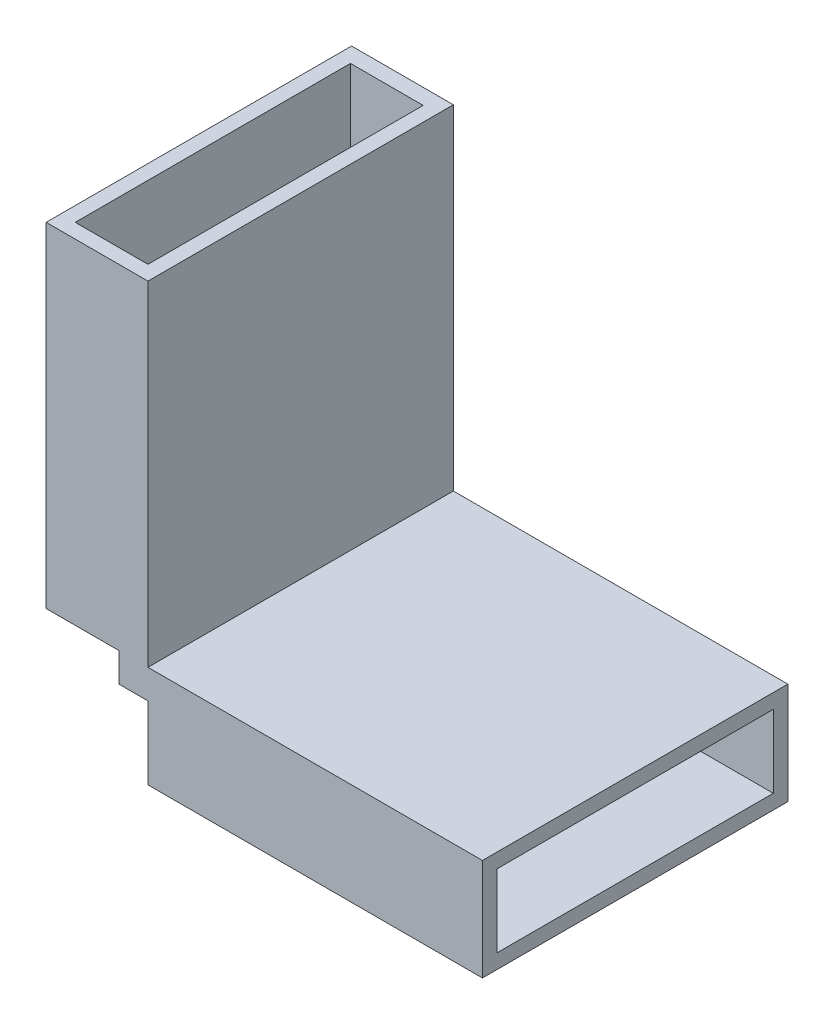
ISO-10303-21;
HEADER;
FILE_DESCRIPTION(('STEP AP214'),'2;1');
FILE_NAME('part.step','',(''),(''),'','','');
FILE_SCHEMA(('AUTOMOTIVE_DESIGN { 1 0 10303 214 1 1 1 1 }'));
ENDSEC;
DATA;
#1=APPLICATION_CONTEXT('core data for automotive mechanical design processes');
#2=APPLICATION_PROTOCOL_DEFINITION('international standard','automotive_design',2000,#1);
#3=PRODUCT_CONTEXT('',#1,'mechanical');
#4=PRODUCT('Part','Part','',(#3));
#5=PRODUCT_RELATED_PRODUCT_CATEGORY('part','',(#4));
#6=PRODUCT_DEFINITION_FORMATION('','',#4);
#7=PRODUCT_DEFINITION_CONTEXT('part definition',#1,'design');
#8=PRODUCT_DEFINITION('design','',#6,#7);
#9=PRODUCT_DEFINITION_SHAPE('','',#8);
#10=(LENGTH_UNIT() NAMED_UNIT(*) SI_UNIT(.MILLI.,.METRE.));
#11=(NAMED_UNIT(*) PLANE_ANGLE_UNIT() SI_UNIT($,.RADIAN.));
#12=(NAMED_UNIT(*) SI_UNIT($,.STERADIAN.) SOLID_ANGLE_UNIT());
#13=UNCERTAINTY_MEASURE_WITH_UNIT(LENGTH_MEASURE(1.E-05),#10,'distance_accuracy_value','');
#14=(GEOMETRIC_REPRESENTATION_CONTEXT(3) GLOBAL_UNCERTAINTY_ASSIGNED_CONTEXT((#13)) GLOBAL_UNIT_ASSIGNED_CONTEXT((#10,
#11,#12)) REPRESENTATION_CONTEXT('',''));
#15=CARTESIAN_POINT('',(0.,0.,0.));
#16=DIRECTION('',(0.,0.,1.));
#17=DIRECTION('',(1.,0.,0.));
#18=AXIS2_PLACEMENT_3D('',#15,#16,#17);
#19=CARTESIAN_POINT('',(30.,0.,7.));
#20=DIRECTION('',(-1.,0.,0.));
#21=DIRECTION('',(0.,0.,1.));
#22=AXIS2_PLACEMENT_3D('',#19,#20,#21);
#23=PLANE('',#22);
#24=DIRECTION('',(0.,0.,-1.));
#25=VECTOR('',#24,1.);
#26=CARTESIAN_POINT('',(30.,6.,27.));
#27=LINE('',#26,#25);
#28=CARTESIAN_POINT('',(30.,6.,26.));
#29=VERTEX_POINT('',#28);
#30=CARTESIAN_POINT('',(30.,6.,7.));
#31=VERTEX_POINT('',#30);
#32=EDGE_CURVE('E197',#29,#31,#27,.T.);
#33=ORIENTED_EDGE('',*,*,#32,.T.);
#34=DIRECTION('',(0.,1.,0.));
#35=VECTOR('',#34,1.);
#36=CARTESIAN_POINT('',(30.,0.999999999999997,7.));
#37=LINE('',#36,#35);
#38=CARTESIAN_POINT('',(30.,0.999999999999997,7.));
#39=VERTEX_POINT('',#38);
#40=EDGE_CURVE('E293',#39,#31,#37,.T.);
#41=ORIENTED_EDGE('',*,*,#40,.F.);
#42=DIRECTION('',(0.,0.,-1.));
#43=VECTOR('',#42,1.);
#44=CARTESIAN_POINT('',(30.,1.,7.));
#45=LINE('',#44,#43);
#46=CARTESIAN_POINT('',(30.,1.,26.));
#47=VERTEX_POINT('',#46);
#48=EDGE_CURVE('E190',#47,#39,#45,.T.);
#49=ORIENTED_EDGE('',*,*,#48,.F.);
#50=DIRECTION('',(0.,1.,0.));
#51=VECTOR('',#50,1.);
#52=CARTESIAN_POINT('',(30.,0.,26.));
#53=LINE('',#52,#51);
#54=EDGE_CURVE('E202',#47,#29,#53,.T.);
#55=ORIENTED_EDGE('',*,*,#54,.T.);
#56=EDGE_LOOP('',(#33,#41,#49,#55));
#57=FACE_BOUND('',#56,.T.);
#58=DIRECTION('',(0.,1.,0.));
#59=VECTOR('',#58,1.);
#60=CARTESIAN_POINT('',(30.,0.,6.));
#61=LINE('',#60,#59);
#62=CARTESIAN_POINT('',(30.,0.,6.));
#63=VERTEX_POINT('',#62);
#64=CARTESIAN_POINT('',(30.,7.,6.));
#65=VERTEX_POINT('',#64);
#66=EDGE_CURVE('E187',#63,#65,#61,.T.);
#67=ORIENTED_EDGE('',*,*,#66,.T.);
#68=DIRECTION('',(0.,0.,-1.));
#69=VECTOR('',#68,1.);
#70=CARTESIAN_POINT('',(30.,7.,27.));
#71=LINE('',#70,#69);
#72=CARTESIAN_POINT('',(30.,7.,27.));
#73=VERTEX_POINT('',#72);
#74=EDGE_CURVE('E52',#73,#65,#71,.T.);
#75=ORIENTED_EDGE('',*,*,#74,.F.);
#76=DIRECTION('',(0.,1.,0.));
#77=VECTOR('',#76,1.);
#78=CARTESIAN_POINT('',(30.,7.,27.));
#79=LINE('',#78,#77);
#80=CARTESIAN_POINT('',(30.,0.,27.));
#81=VERTEX_POINT('',#80);
#82=EDGE_CURVE('E213',#81,#73,#79,.T.);
#83=ORIENTED_EDGE('',*,*,#82,.F.);
#84=DIRECTION('',(0.,0.,-1.));
#85=VECTOR('',#84,1.);
#86=CARTESIAN_POINT('',(30.,0.,7.));
#87=LINE('',#86,#85);
#88=EDGE_CURVE('E243',#81,#63,#87,.T.);
#89=ORIENTED_EDGE('',*,*,#88,.T.);
#90=EDGE_LOOP('',(#67,#75,#83,#89));
#91=FACE_BOUND('',#90,.T.);
#92=ADVANCED_FACE('F37',(#57,#91),#23,.F.);
#93=CARTESIAN_POINT('',(0.,30.,7.));
#94=DIRECTION('',(0.,-1.,0.));
#95=DIRECTION('',(0.,0.,-1.));
#96=AXIS2_PLACEMENT_3D('',#93,#94,#95);
#97=PLANE('',#96);
#98=DIRECTION('',(1.,0.,0.));
#99=VECTOR('',#98,1.);
#100=CARTESIAN_POINT('',(1.,30.,7.07514362919426));
#101=LINE('',#100,#99);
#102=CARTESIAN_POINT('',(1.,30.,7.07514362919426));
#103=VERTEX_POINT('',#102);
#104=CARTESIAN_POINT('',(6.,30.,7.07514362919426));
#105=VERTEX_POINT('',#104);
#106=EDGE_CURVE('E280',#103,#105,#101,.T.);
#107=ORIENTED_EDGE('',*,*,#106,.T.);
#108=DIRECTION('',(0.,0.,-1.));
#109=VECTOR('',#108,1.);
#110=CARTESIAN_POINT('',(6.,30.,7.));
#111=LINE('',#110,#109);
#112=CARTESIAN_POINT('',(6.,30.,26.));
#113=VERTEX_POINT('',#112);
#114=EDGE_CURVE('E192',#113,#105,#111,.T.);
#115=ORIENTED_EDGE('',*,*,#114,.F.);
#116=DIRECTION('',(-1.,0.,0.));
#117=VECTOR('',#116,1.);
#118=CARTESIAN_POINT('',(0.,30.,26.));
#119=LINE('',#118,#117);
#120=CARTESIAN_POINT('',(1.,30.,26.));
#121=VERTEX_POINT('',#120);
#122=EDGE_CURVE('E310',#113,#121,#119,.T.);
#123=ORIENTED_EDGE('',*,*,#122,.T.);
#124=DIRECTION('',(0.,0.,-1.));
#125=VECTOR('',#124,1.);
#126=CARTESIAN_POINT('',(1.,30.,7.));
#127=LINE('',#126,#125);
#128=EDGE_CURVE('E186',#121,#103,#127,.T.);
#129=ORIENTED_EDGE('',*,*,#128,.T.);
#130=EDGE_LOOP('',(#107,#115,#123,#129));
#131=FACE_BOUND('',#130,.T.);
#132=DIRECTION('',(0.,0.,-1.));
#133=VECTOR('',#132,1.);
#134=CARTESIAN_POINT('',(7.,30.,27.));
#135=LINE('',#134,#133);
#136=CARTESIAN_POINT('',(7.,30.,27.));
#137=VERTEX_POINT('',#136);
#138=CARTESIAN_POINT('',(7.,30.,6.));
#139=VERTEX_POINT('',#138);
#140=EDGE_CURVE('E239',#137,#139,#135,.T.);
#141=ORIENTED_EDGE('',*,*,#140,.T.);
#142=DIRECTION('',(-1.,0.,0.));
#143=VECTOR('',#142,1.);
#144=CARTESIAN_POINT('',(0.,30.,6.));
#145=LINE('',#144,#143);
#146=CARTESIAN_POINT('',(0.,30.,6.));
#147=VERTEX_POINT('',#146);
#148=EDGE_CURVE('E180',#139,#147,#145,.T.);
#149=ORIENTED_EDGE('',*,*,#148,.T.);
#150=DIRECTION('',(0.,0.,-1.));
#151=VECTOR('',#150,1.);
#152=CARTESIAN_POINT('',(0.,30.,7.));
#153=LINE('',#152,#151);
#154=CARTESIAN_POINT('',(0.,30.,27.));
#155=VERTEX_POINT('',#154);
#156=EDGE_CURVE('E241',#155,#147,#153,.T.);
#157=ORIENTED_EDGE('',*,*,#156,.F.);
#158=DIRECTION('',(-1.,0.,0.));
#159=VECTOR('',#158,1.);
#160=CARTESIAN_POINT('',(0.,30.,27.));
#161=LINE('',#160,#159);
#162=EDGE_CURVE('E231',#137,#155,#161,.T.);
#163=ORIENTED_EDGE('',*,*,#162,.F.);
#164=EDGE_LOOP('',(#141,#149,#157,#163));
#165=FACE_BOUND('',#164,.T.);
#166=ADVANCED_FACE('F323',(#131,#165),#97,.F.);
#167=CARTESIAN_POINT('',(0.,0.,7.));
#168=DIRECTION('',(1.,0.,0.));
#169=DIRECTION('',(0.,0.,-1.));
#170=AXIS2_PLACEMENT_3D('',#167,#168,#169);
#171=PLANE('',#170);
#172=DIRECTION('',(0.,1.,0.));
#173=VECTOR('',#172,1.);
#174=CARTESIAN_POINT('',(0.,0.,6.));
#175=LINE('',#174,#173);
#176=CARTESIAN_POINT('',(0.,7.,6.));
#177=VERTEX_POINT('',#176);
#178=EDGE_CURVE('E183',#177,#147,#175,.T.);
#179=ORIENTED_EDGE('',*,*,#178,.F.);
#180=DIRECTION('',(0.,0.,-1.));
#181=VECTOR('',#180,1.);
#182=CARTESIAN_POINT('',(0.,7.,27.));
#183=LINE('',#182,#181);
#184=CARTESIAN_POINT('',(0.,7.,27.));
#185=VERTEX_POINT('',#184);
#186=EDGE_CURVE('E237',#185,#177,#183,.T.);
#187=ORIENTED_EDGE('',*,*,#186,.F.);
#188=DIRECTION('',(0.,-1.,0.));
#189=VECTOR('',#188,1.);
#190=CARTESIAN_POINT('',(0.,0.,27.));
#191=LINE('',#190,#189);
#192=EDGE_CURVE('E234',#155,#185,#191,.T.);
#193=ORIENTED_EDGE('',*,*,#192,.F.);
#194=ORIENTED_EDGE('',*,*,#156,.T.);
#195=EDGE_LOOP('',(#179,#187,#193,#194));
#196=FACE_BOUND('',#195,.T.);
#197=ADVANCED_FACE('F39',(#196),#171,.F.);
#198=CARTESIAN_POINT('',(0.,0.,7.));
#199=DIRECTION('',(0.,1.,0.));
#200=DIRECTION('',(0.,0.,1.));
#201=AXIS2_PLACEMENT_3D('',#198,#199,#200);
#202=PLANE('',#201);
#203=DIRECTION('',(0.,0.,-1.));
#204=VECTOR('',#203,1.);
#205=CARTESIAN_POINT('',(7.,0.,27.));
#206=LINE('',#205,#204);
#207=CARTESIAN_POINT('',(7.,0.,27.));
#208=VERTEX_POINT('',#207);
#209=CARTESIAN_POINT('',(7.,0.,6.));
#210=VERTEX_POINT('',#209);
#211=EDGE_CURVE('E217',#208,#210,#206,.T.);
#212=ORIENTED_EDGE('',*,*,#211,.T.);
#213=DIRECTION('',(-1.,0.,0.));
#214=VECTOR('',#213,1.);
#215=CARTESIAN_POINT('',(30.,0.,6.));
#216=LINE('',#215,#214);
#217=EDGE_CURVE('E278',#63,#210,#216,.T.);
#218=ORIENTED_EDGE('',*,*,#217,.F.);
#219=ORIENTED_EDGE('',*,*,#88,.F.);
#220=DIRECTION('',(1.,0.,0.));
#221=VECTOR('',#220,1.);
#222=CARTESIAN_POINT('',(7.,0.,27.));
#223=LINE('',#222,#221);
#224=EDGE_CURVE('E210',#208,#81,#223,.T.);
#225=ORIENTED_EDGE('',*,*,#224,.F.);
#226=EDGE_LOOP('',(#212,#218,#219,#225));
#227=FACE_BOUND('',#226,.T.);
#228=ADVANCED_FACE('F342',(#227),#202,.F.);
#229=CARTESIAN_POINT('',(6.,0.,27.));
#230=DIRECTION('',(-1.,0.,0.));
#231=DIRECTION('',(0.,-1.,0.));
#232=AXIS2_PLACEMENT_3D('',#229,#230,#231);
#233=PLANE('',#232);
#234=ORIENTED_EDGE('',*,*,#114,.T.);
#235=DIRECTION('',(0.,1.,0.));
#236=VECTOR('',#235,1.);
#237=CARTESIAN_POINT('',(6.,30.,7.07514362919426));
#238=LINE('',#237,#236);
#239=CARTESIAN_POINT('',(6.,8.,7.07514362919426));
#240=VERTEX_POINT('',#239);
#241=EDGE_CURVE('E277',#240,#105,#238,.T.);
#242=ORIENTED_EDGE('',*,*,#241,.F.);
#243=DIRECTION('',(0.,0.,-1.));
#244=VECTOR('',#243,1.);
#245=CARTESIAN_POINT('',(6.,8.,27.));
#246=LINE('',#245,#244);
#247=CARTESIAN_POINT('',(6.,8.,26.));
#248=VERTEX_POINT('',#247);
#249=EDGE_CURVE('E297',#248,#240,#246,.T.);
#250=ORIENTED_EDGE('',*,*,#249,.F.);
#251=DIRECTION('',(0.,1.,0.));
#252=VECTOR('',#251,1.);
#253=CARTESIAN_POINT('',(6.,0.,26.));
#254=LINE('',#253,#252);
#255=EDGE_CURVE('E303',#248,#113,#254,.T.);
#256=ORIENTED_EDGE('',*,*,#255,.T.);
#257=EDGE_LOOP('',(#234,#242,#250,#256));
#258=FACE_BOUND('',#257,.T.);
#259=ADVANCED_FACE('F340',(#258),#233,.T.);
#260=CARTESIAN_POINT('',(0.,8.,27.));
#261=DIRECTION('',(0.,-1.,0.));
#262=DIRECTION('',(1.,0.,0.));
#263=AXIS2_PLACEMENT_3D('',#260,#261,#262);
#264=PLANE('',#263);
#265=DIRECTION('',(1.,0.,0.));
#266=VECTOR('',#265,1.);
#267=CARTESIAN_POINT('',(0.,8.,7.07514362919426));
#268=LINE('',#267,#266);
#269=CARTESIAN_POINT('',(1.,8.,7.07514362919426));
#270=VERTEX_POINT('',#269);
#271=EDGE_CURVE('E287',#270,#240,#268,.T.);
#272=ORIENTED_EDGE('',*,*,#271,.F.);
#273=DIRECTION('',(0.,0.,-1.));
#274=VECTOR('',#273,1.);
#275=CARTESIAN_POINT('',(1.,8.,7.));
#276=LINE('',#275,#274);
#277=CARTESIAN_POINT('',(1.,8.,26.));
#278=VERTEX_POINT('',#277);
#279=EDGE_CURVE('E304',#278,#270,#276,.T.);
#280=ORIENTED_EDGE('',*,*,#279,.F.);
#281=DIRECTION('',(-1.,0.,0.));
#282=VECTOR('',#281,1.);
#283=CARTESIAN_POINT('',(0.,8.,26.));
#284=LINE('',#283,#282);
#285=EDGE_CURVE('E300',#248,#278,#284,.T.);
#286=ORIENTED_EDGE('',*,*,#285,.F.);
#287=ORIENTED_EDGE('',*,*,#249,.T.);
#288=EDGE_LOOP('',(#272,#280,#286,#287));
#289=FACE_BOUND('',#288,.T.);
#290=ADVANCED_FACE('F335',(#289),#264,.F.);
#291=CARTESIAN_POINT('',(1.,0.,7.));
#292=DIRECTION('',(1.,0.,0.));
#293=DIRECTION('',(0.,0.,-1.));
#294=AXIS2_PLACEMENT_3D('',#291,#292,#293);
#295=PLANE('',#294);
#296=ORIENTED_EDGE('',*,*,#279,.T.);
#297=DIRECTION('',(0.,1.,0.));
#298=VECTOR('',#297,1.);
#299=CARTESIAN_POINT('',(1.,0.,7.07514362919426));
#300=LINE('',#299,#298);
#301=EDGE_CURVE('E249',#270,#103,#300,.T.);
#302=ORIENTED_EDGE('',*,*,#301,.T.);
#303=ORIENTED_EDGE('',*,*,#128,.F.);
#304=DIRECTION('',(0.,-1.,0.));
#305=VECTOR('',#304,1.);
#306=CARTESIAN_POINT('',(1.,0.,26.));
#307=LINE('',#306,#305);
#308=EDGE_CURVE('E307',#121,#278,#307,.T.);
#309=ORIENTED_EDGE('',*,*,#308,.T.);
#310=EDGE_LOOP('',(#296,#302,#303,#309));
#311=FACE_BOUND('',#310,.T.);
#312=ADVANCED_FACE('F332',(#311),#295,.T.);
#313=CARTESIAN_POINT('',(7.,6.,27.));
#314=DIRECTION('',(0.,-1.,0.));
#315=DIRECTION('',(0.,0.,-1.));
#316=AXIS2_PLACEMENT_3D('',#313,#314,#315);
#317=PLANE('',#316);
#318=DIRECTION('',(0.,0.,-1.));
#319=VECTOR('',#318,1.);
#320=CARTESIAN_POINT('',(8.,6.,27.));
#321=LINE('',#320,#319);
#322=CARTESIAN_POINT('',(8.,6.,26.));
#323=VERTEX_POINT('',#322);
#324=CARTESIAN_POINT('',(8.,6.,7.));
#325=VERTEX_POINT('',#324);
#326=EDGE_CURVE('E301',#323,#325,#321,.T.);
#327=ORIENTED_EDGE('',*,*,#326,.T.);
#328=DIRECTION('',(-1.,0.,0.));
#329=VECTOR('',#328,1.);
#330=CARTESIAN_POINT('',(30.,6.,7.));
#331=LINE('',#330,#329);
#332=EDGE_CURVE('E289',#31,#325,#331,.T.);
#333=ORIENTED_EDGE('',*,*,#332,.F.);
#334=ORIENTED_EDGE('',*,*,#32,.F.);
#335=DIRECTION('',(-1.,0.,0.));
#336=VECTOR('',#335,1.);
#337=CARTESIAN_POINT('',(7.,6.,26.));
#338=LINE('',#337,#336);
#339=EDGE_CURVE('E201',#29,#323,#338,.T.);
#340=ORIENTED_EDGE('',*,*,#339,.T.);
#341=EDGE_LOOP('',(#327,#333,#334,#340));
#342=FACE_BOUND('',#341,.T.);
#343=ADVANCED_FACE('F379',(#342),#317,.T.);
#344=CARTESIAN_POINT('',(0.,1.,7.));
#345=DIRECTION('',(0.,1.,0.));
#346=DIRECTION('',(0.,0.,1.));
#347=AXIS2_PLACEMENT_3D('',#344,#345,#346);
#348=PLANE('',#347);
#349=ORIENTED_EDGE('',*,*,#48,.T.);
#350=DIRECTION('',(-1.,0.,0.));
#351=VECTOR('',#350,1.);
#352=CARTESIAN_POINT('',(30.,0.999999999999997,7.));
#353=LINE('',#352,#351);
#354=CARTESIAN_POINT('',(8.,0.999999999999997,7.));
#355=VERTEX_POINT('',#354);
#356=EDGE_CURVE('E290',#39,#355,#353,.T.);
#357=ORIENTED_EDGE('',*,*,#356,.T.);
#358=DIRECTION('',(0.,0.,-1.));
#359=VECTOR('',#358,1.);
#360=CARTESIAN_POINT('',(8.,1.,7.));
#361=LINE('',#360,#359);
#362=CARTESIAN_POINT('',(8.,1.,26.));
#363=VERTEX_POINT('',#362);
#364=EDGE_CURVE('E200',#363,#355,#361,.T.);
#365=ORIENTED_EDGE('',*,*,#364,.F.);
#366=DIRECTION('',(1.,0.,0.));
#367=VECTOR('',#366,1.);
#368=CARTESIAN_POINT('',(0.,1.,26.));
#369=LINE('',#368,#367);
#370=EDGE_CURVE('E205',#363,#47,#369,.T.);
#371=ORIENTED_EDGE('',*,*,#370,.T.);
#372=EDGE_LOOP('',(#349,#357,#365,#371));
#373=FACE_BOUND('',#372,.T.);
#374=ADVANCED_FACE('F382',(#373),#348,.T.);
#375=CARTESIAN_POINT('',(8.,7.,27.));
#376=DIRECTION('',(1.,0.,0.));
#377=DIRECTION('',(0.,0.,-1.));
#378=AXIS2_PLACEMENT_3D('',#375,#376,#377);
#379=PLANE('',#378);
#380=ORIENTED_EDGE('',*,*,#364,.T.);
#381=DIRECTION('',(0.,1.,0.));
#382=VECTOR('',#381,1.);
#383=CARTESIAN_POINT('',(8.,7.,7.));
#384=LINE('',#383,#382);
#385=EDGE_CURVE('E246',#355,#325,#384,.T.);
#386=ORIENTED_EDGE('',*,*,#385,.T.);
#387=ORIENTED_EDGE('',*,*,#326,.F.);
#388=DIRECTION('',(0.,-1.,0.));
#389=VECTOR('',#388,1.);
#390=CARTESIAN_POINT('',(8.,7.,26.));
#391=LINE('',#390,#389);
#392=EDGE_CURVE('E296',#323,#363,#391,.T.);
#393=ORIENTED_EDGE('',*,*,#392,.T.);
#394=EDGE_LOOP('',(#380,#386,#387,#393));
#395=FACE_BOUND('',#394,.T.);
#396=ADVANCED_FACE('F364',(#395),#379,.T.);
#397=CARTESIAN_POINT('',(7.,0.,27.));
#398=DIRECTION('',(-1.,0.,0.));
#399=DIRECTION('',(0.,-1.,0.));
#400=AXIS2_PLACEMENT_3D('',#397,#398,#399);
#401=PLANE('',#400);
#402=DIRECTION('',(0.,0.,-1.));
#403=VECTOR('',#402,1.);
#404=CARTESIAN_POINT('',(7.,7.,27.));
#405=LINE('',#404,#403);
#406=CARTESIAN_POINT('',(7.,7.,27.));
#407=VERTEX_POINT('',#406);
#408=CARTESIAN_POINT('',(7.,7.,6.));
#409=VERTEX_POINT('',#408);
#410=EDGE_CURVE('E165',#407,#409,#405,.T.);
#411=ORIENTED_EDGE('',*,*,#410,.T.);
#412=DIRECTION('',(0.,1.,0.));
#413=VECTOR('',#412,1.);
#414=CARTESIAN_POINT('',(7.,0.,6.));
#415=LINE('',#414,#413);
#416=EDGE_CURVE('E11',#409,#139,#415,.T.);
#417=ORIENTED_EDGE('',*,*,#416,.T.);
#418=ORIENTED_EDGE('',*,*,#140,.F.);
#419=DIRECTION('',(0.,1.,0.));
#420=VECTOR('',#419,1.);
#421=CARTESIAN_POINT('',(7.,0.,27.));
#422=LINE('',#421,#420);
#423=EDGE_CURVE('E170',#407,#137,#422,.T.);
#424=ORIENTED_EDGE('',*,*,#423,.F.);
#425=EDGE_LOOP('',(#411,#417,#418,#424));
#426=FACE_BOUND('',#425,.T.);
#427=ADVANCED_FACE('F166',(#426),#401,.F.);
#428=CARTESIAN_POINT('',(0.,7.,27.));
#429=DIRECTION('',(0.,-1.,0.));
#430=DIRECTION('',(1.,0.,0.));
#431=AXIS2_PLACEMENT_3D('',#428,#429,#430);
#432=PLANE('',#431);
#433=ORIENTED_EDGE('',*,*,#186,.T.);
#434=DIRECTION('',(1.,0.,0.));
#435=VECTOR('',#434,1.);
#436=CARTESIAN_POINT('',(0.,7.,6.));
#437=LINE('',#436,#435);
#438=CARTESIAN_POINT('',(5.,7.,6.));
#439=VERTEX_POINT('',#438);
#440=EDGE_CURVE('E177',#177,#439,#437,.T.);
#441=ORIENTED_EDGE('',*,*,#440,.T.);
#442=DIRECTION('',(0.,0.,-1.));
#443=VECTOR('',#442,1.);
#444=CARTESIAN_POINT('',(5.,7.,27.));
#445=LINE('',#444,#443);
#446=CARTESIAN_POINT('',(5.,7.,27.));
#447=VERTEX_POINT('',#446);
#448=EDGE_CURVE('E226',#447,#439,#445,.T.);
#449=ORIENTED_EDGE('',*,*,#448,.F.);
#450=DIRECTION('',(-1.,0.,0.));
#451=VECTOR('',#450,1.);
#452=CARTESIAN_POINT('',(0.,7.,27.));
#453=LINE('',#452,#451);
#454=EDGE_CURVE('E228',#447,#185,#453,.T.);
#455=ORIENTED_EDGE('',*,*,#454,.T.);
#456=EDGE_LOOP('',(#433,#441,#449,#455));
#457=FACE_BOUND('',#456,.T.);
#458=ADVANCED_FACE('F263',(#457),#432,.T.);
#459=CARTESIAN_POINT('',(0.,0.,27.));
#460=DIRECTION('',(0.,0.,1.));
#461=DIRECTION('',(1.,0.,0.));
#462=AXIS2_PLACEMENT_3D('',#459,#460,#461);
#463=PLANE('',#462);
#464=ORIENTED_EDGE('',*,*,#454,.F.);
#465=DIRECTION('',(0.,-1.,0.));
#466=VECTOR('',#465,1.);
#467=CARTESIAN_POINT('',(5.,7.,27.));
#468=LINE('',#467,#466);
#469=CARTESIAN_POINT('',(5.,5.,27.));
#470=VERTEX_POINT('',#469);
#471=EDGE_CURVE('E219',#447,#470,#468,.T.);
#472=ORIENTED_EDGE('',*,*,#471,.T.);
#473=DIRECTION('',(1.,0.,0.));
#474=VECTOR('',#473,1.);
#475=CARTESIAN_POINT('',(7.,5.,27.));
#476=LINE('',#475,#474);
#477=CARTESIAN_POINT('',(7.,5.,27.));
#478=VERTEX_POINT('',#477);
#479=EDGE_CURVE('E221',#470,#478,#476,.T.);
#480=ORIENTED_EDGE('',*,*,#479,.T.);
#481=DIRECTION('',(0.,-1.,0.));
#482=VECTOR('',#481,1.);
#483=CARTESIAN_POINT('',(7.,7.,27.));
#484=LINE('',#483,#482);
#485=EDGE_CURVE('E208',#478,#208,#484,.T.);
#486=ORIENTED_EDGE('',*,*,#485,.T.);
#487=ORIENTED_EDGE('',*,*,#224,.T.);
#488=ORIENTED_EDGE('',*,*,#82,.T.);
#489=DIRECTION('',(-1.,0.,0.));
#490=VECTOR('',#489,1.);
#491=CARTESIAN_POINT('',(7.,7.,27.));
#492=LINE('',#491,#490);
#493=EDGE_CURVE('E172',#73,#407,#492,.T.);
#494=ORIENTED_EDGE('',*,*,#493,.T.);
#495=ORIENTED_EDGE('',*,*,#423,.T.);
#496=ORIENTED_EDGE('',*,*,#162,.T.);
#497=ORIENTED_EDGE('',*,*,#192,.T.);
#498=EDGE_LOOP('',(#464,#472,#480,#486,#487,#488,#494,#495,#496,#497));
#499=FACE_BOUND('',#498,.T.);
#500=ADVANCED_FACE('F273',(#499),#463,.T.);
#501=CARTESIAN_POINT('',(5.,7.,27.));
#502=DIRECTION('',(1.,0.,0.));
#503=DIRECTION('',(0.,0.,-1.));
#504=AXIS2_PLACEMENT_3D('',#501,#502,#503);
#505=PLANE('',#504);
#506=ORIENTED_EDGE('',*,*,#448,.T.);
#507=DIRECTION('',(0.,-1.,0.));
#508=VECTOR('',#507,1.);
#509=CARTESIAN_POINT('',(5.,0.,6.));
#510=LINE('',#509,#508);
#511=CARTESIAN_POINT('',(5.,5.,6.));
#512=VERTEX_POINT('',#511);
#513=EDGE_CURVE('E256',#439,#512,#510,.T.);
#514=ORIENTED_EDGE('',*,*,#513,.T.);
#515=DIRECTION('',(0.,0.,-1.));
#516=VECTOR('',#515,1.);
#517=CARTESIAN_POINT('',(5.,5.,27.));
#518=LINE('',#517,#516);
#519=EDGE_CURVE('E224',#470,#512,#518,.T.);
#520=ORIENTED_EDGE('',*,*,#519,.F.);
#521=ORIENTED_EDGE('',*,*,#471,.F.);
#522=EDGE_LOOP('',(#506,#514,#520,#521));
#523=FACE_BOUND('',#522,.T.);
#524=ADVANCED_FACE('F270',(#523),#505,.F.);
#525=CARTESIAN_POINT('',(7.,5.,27.));
#526=DIRECTION('',(0.,1.,0.));
#527=DIRECTION('',(0.,0.,1.));
#528=AXIS2_PLACEMENT_3D('',#525,#526,#527);
#529=PLANE('',#528);
#530=ORIENTED_EDGE('',*,*,#519,.T.);
#531=DIRECTION('',(1.,0.,0.));
#532=VECTOR('',#531,1.);
#533=CARTESIAN_POINT('',(0.,5.,6.));
#534=LINE('',#533,#532);
#535=CARTESIAN_POINT('',(7.,5.,6.));
#536=VERTEX_POINT('',#535);
#537=EDGE_CURVE('E254',#512,#536,#534,.T.);
#538=ORIENTED_EDGE('',*,*,#537,.T.);
#539=DIRECTION('',(0.,0.,-1.));
#540=VECTOR('',#539,1.);
#541=CARTESIAN_POINT('',(7.,5.,27.));
#542=LINE('',#541,#540);
#543=EDGE_CURVE('E60',#478,#536,#542,.T.);
#544=ORIENTED_EDGE('',*,*,#543,.F.);
#545=ORIENTED_EDGE('',*,*,#479,.F.);
#546=EDGE_LOOP('',(#530,#538,#544,#545));
#547=FACE_BOUND('',#546,.T.);
#548=ADVANCED_FACE('F369',(#547),#529,.F.);
#549=CARTESIAN_POINT('',(7.,7.,27.));
#550=DIRECTION('',(1.,0.,0.));
#551=DIRECTION('',(0.,0.,-1.));
#552=AXIS2_PLACEMENT_3D('',#549,#550,#551);
#553=PLANE('',#552);
#554=ORIENTED_EDGE('',*,*,#485,.F.);
#555=ORIENTED_EDGE('',*,*,#543,.T.);
#556=DIRECTION('',(0.,-1.,0.));
#557=VECTOR('',#556,1.);
#558=CARTESIAN_POINT('',(7.,0.,6.));
#559=LINE('',#558,#557);
#560=EDGE_CURVE('E252',#536,#210,#559,.T.);
#561=ORIENTED_EDGE('',*,*,#560,.T.);
#562=ORIENTED_EDGE('',*,*,#211,.F.);
#563=EDGE_LOOP('',(#554,#555,#561,#562));
#564=FACE_BOUND('',#563,.T.);
#565=ADVANCED_FACE('F372',(#564),#553,.F.);
#566=CARTESIAN_POINT('',(7.,7.,27.));
#567=DIRECTION('',(0.,-1.,0.));
#568=DIRECTION('',(0.,0.,-1.));
#569=AXIS2_PLACEMENT_3D('',#566,#567,#568);
#570=PLANE('',#569);
#571=ORIENTED_EDGE('',*,*,#74,.T.);
#572=DIRECTION('',(-1.,0.,0.));
#573=VECTOR('',#572,1.);
#574=CARTESIAN_POINT('',(0.,7.,6.));
#575=LINE('',#574,#573);
#576=EDGE_CURVE('E45',#65,#409,#575,.T.);
#577=ORIENTED_EDGE('',*,*,#576,.T.);
#578=ORIENTED_EDGE('',*,*,#410,.F.);
#579=ORIENTED_EDGE('',*,*,#493,.F.);
#580=EDGE_LOOP('',(#571,#577,#578,#579));
#581=FACE_BOUND('',#580,.T.);
#582=ADVANCED_FACE('F174',(#581),#570,.F.);
#583=CARTESIAN_POINT('',(0.,0.,26.));
#584=DIRECTION('',(0.,0.,1.));
#585=DIRECTION('',(1.,0.,0.));
#586=AXIS2_PLACEMENT_3D('',#583,#584,#585);
#587=PLANE('',#586);
#588=ORIENTED_EDGE('',*,*,#339,.F.);
#589=ORIENTED_EDGE('',*,*,#54,.F.);
#590=ORIENTED_EDGE('',*,*,#370,.F.);
#591=ORIENTED_EDGE('',*,*,#392,.F.);
#592=EDGE_LOOP('',(#588,#589,#590,#591));
#593=FACE_BOUND('',#592,.T.);
#594=ADVANCED_FACE('F378',(#593),#587,.F.);
#595=CARTESIAN_POINT('',(0.,0.,6.));
#596=DIRECTION('',(0.,0.,-1.));
#597=DIRECTION('',(-1.,0.,0.));
#598=AXIS2_PLACEMENT_3D('',#595,#596,#597);
#599=PLANE('',#598);
#600=ORIENTED_EDGE('',*,*,#416,.F.);
#601=ORIENTED_EDGE('',*,*,#576,.F.);
#602=ORIENTED_EDGE('',*,*,#66,.F.);
#603=ORIENTED_EDGE('',*,*,#217,.T.);
#604=ORIENTED_EDGE('',*,*,#560,.F.);
#605=ORIENTED_EDGE('',*,*,#537,.F.);
#606=ORIENTED_EDGE('',*,*,#513,.F.);
#607=ORIENTED_EDGE('',*,*,#440,.F.);
#608=ORIENTED_EDGE('',*,*,#178,.T.);
#609=ORIENTED_EDGE('',*,*,#148,.F.);
#610=EDGE_LOOP('',(#600,#601,#602,#603,#604,#605,#606,#607,#608,#609));
#611=FACE_BOUND('',#610,.T.);
#612=ADVANCED_FACE('F178',(#611),#599,.T.);
#613=ORIENTED_EDGE('',*,*,#285,.T.);
#614=ORIENTED_EDGE('',*,*,#308,.F.);
#615=ORIENTED_EDGE('',*,*,#122,.F.);
#616=ORIENTED_EDGE('',*,*,#255,.F.);
#617=EDGE_LOOP('',(#613,#614,#615,#616));
#618=FACE_BOUND('',#617,.T.);
#619=ADVANCED_FACE('F328',(#618),#587,.F.);
#620=CARTESIAN_POINT('',(30.,0.999999999999997,7.));
#621=DIRECTION('',(0.,0.,-1.));
#622=DIRECTION('',(-1.,0.,0.));
#623=AXIS2_PLACEMENT_3D('',#620,#621,#622);
#624=PLANE('',#623);
#625=ORIENTED_EDGE('',*,*,#385,.F.);
#626=ORIENTED_EDGE('',*,*,#356,.F.);
#627=ORIENTED_EDGE('',*,*,#40,.T.);
#628=ORIENTED_EDGE('',*,*,#332,.T.);
#629=EDGE_LOOP('',(#625,#626,#627,#628));
#630=FACE_BOUND('',#629,.T.);
#631=ADVANCED_FACE('F389',(#630),#624,.F.);
#632=CARTESIAN_POINT('',(1.,30.,7.07514362919426));
#633=DIRECTION('',(0.,0.,-1.));
#634=DIRECTION('',(0.,1.,0.));
#635=AXIS2_PLACEMENT_3D('',#632,#633,#634);
#636=PLANE('',#635);
#637=ORIENTED_EDGE('',*,*,#301,.F.);
#638=ORIENTED_EDGE('',*,*,#271,.T.);
#639=ORIENTED_EDGE('',*,*,#241,.T.);
#640=ORIENTED_EDGE('',*,*,#106,.F.);
#641=EDGE_LOOP('',(#637,#638,#639,#640));
#642=FACE_BOUND('',#641,.T.);
#643=ADVANCED_FACE('F338',(#642),#636,.F.);
#644=CLOSED_SHELL('',(#92,#166,#197,#228,#259,#290,#312,#343,#374,#396,#427,#458,#500,#524,#548,
#565,#582,#594,#612,#619,#631,#643));
#645=MANIFOLD_SOLID_BREP('B2',#644);
#646=ADVANCED_BREP_SHAPE_REPRESENTATION('',(#18,#645),#14);
#647=SHAPE_DEFINITION_REPRESENTATION(#9,#646);
ENDSEC;
END-ISO-10303-21;
